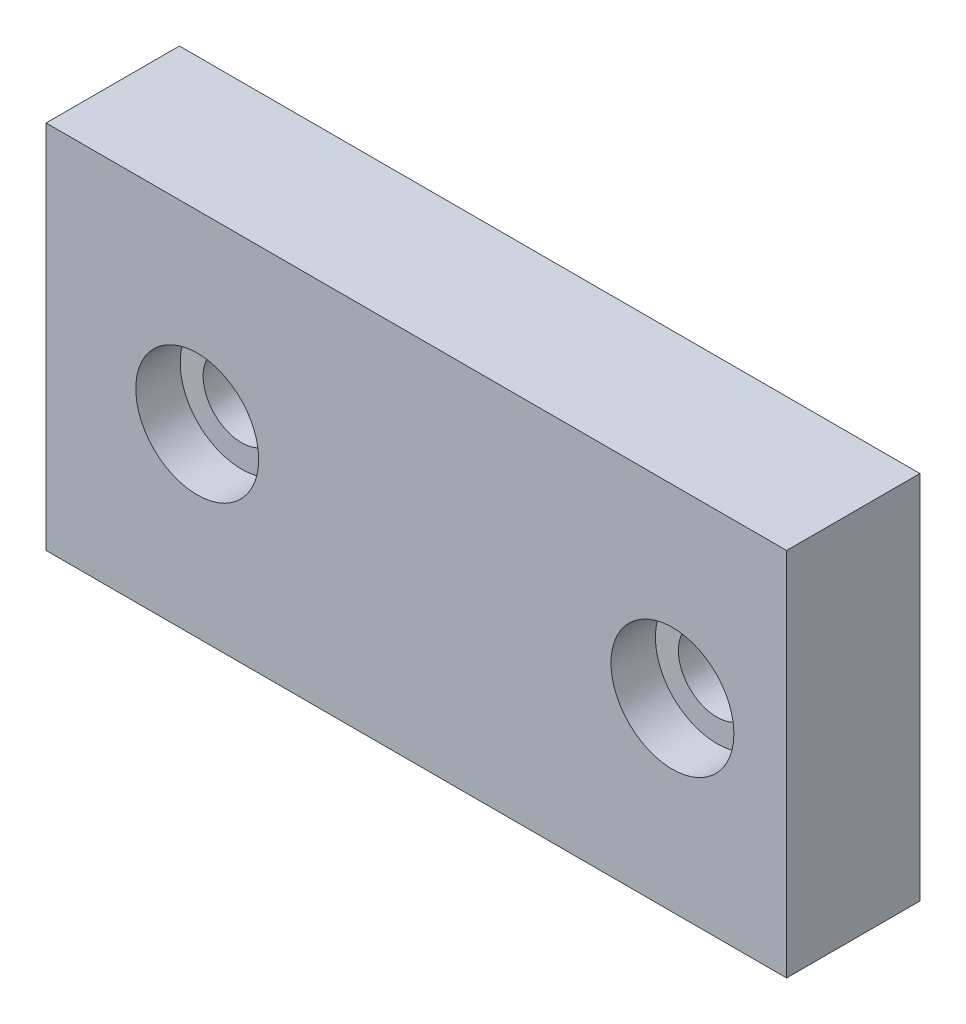
ISO-10303-21;
HEADER;
FILE_DESCRIPTION(('STEP AP214'),'2;1');
FILE_NAME('part.step','',(''),(''),'','','');
FILE_SCHEMA(('AUTOMOTIVE_DESIGN { 1 0 10303 214 1 1 1 1 }'));
ENDSEC;
DATA;
#1=APPLICATION_CONTEXT('core data for automotive mechanical design processes');
#2=APPLICATION_PROTOCOL_DEFINITION('international standard','automotive_design',2000,#1);
#3=PRODUCT_CONTEXT('',#1,'mechanical');
#4=PRODUCT('Part','Part','',(#3));
#5=PRODUCT_RELATED_PRODUCT_CATEGORY('part','',(#4));
#6=PRODUCT_DEFINITION_FORMATION('','',#4);
#7=PRODUCT_DEFINITION_CONTEXT('part definition',#1,'design');
#8=PRODUCT_DEFINITION('design','',#6,#7);
#9=PRODUCT_DEFINITION_SHAPE('','',#8);
#10=(LENGTH_UNIT() NAMED_UNIT(*) SI_UNIT(.MILLI.,.METRE.));
#11=(NAMED_UNIT(*) PLANE_ANGLE_UNIT() SI_UNIT($,.RADIAN.));
#12=(NAMED_UNIT(*) SI_UNIT($,.STERADIAN.) SOLID_ANGLE_UNIT());
#13=UNCERTAINTY_MEASURE_WITH_UNIT(LENGTH_MEASURE(1.E-05),#10,'distance_accuracy_value','');
#14=(GEOMETRIC_REPRESENTATION_CONTEXT(3) GLOBAL_UNCERTAINTY_ASSIGNED_CONTEXT((#13)) GLOBAL_UNIT_ASSIGNED_CONTEXT((#10,
#11,#12)) REPRESENTATION_CONTEXT('',''));
#15=CARTESIAN_POINT('',(0.,0.,0.));
#16=DIRECTION('',(0.,0.,1.));
#17=DIRECTION('',(1.,0.,0.));
#18=AXIS2_PLACEMENT_3D('',#15,#16,#17);
#19=CARTESIAN_POINT('',(96.2916372040886,12.5,-75.));
#20=DIRECTION('',(0.,0.,1.));
#21=DIRECTION('',(1.,0.,0.));
#22=AXIS2_PLACEMENT_3D('',#19,#20,#21);
#23=CYLINDRICAL_SURFACE('',#22,2.6);
#24=CARTESIAN_POINT('',(96.2916372040886,12.5,17.5));
#25=DIRECTION('',(0.,0.,1.));
#26=DIRECTION('',(1.,0.,0.));
#27=AXIS2_PLACEMENT_3D('',#24,#25,#26);
#28=CIRCLE('',#27,2.6);
#29=CARTESIAN_POINT('',(98.8916372040886,12.5,17.5));
#30=VERTEX_POINT('',#29);
#31=EDGE_CURVE('E108',#30,#30,#28,.T.);
#32=ORIENTED_EDGE('',*,*,#31,.F.);
#33=EDGE_LOOP('',(#32));
#34=FACE_BOUND('',#33,.T.);
#35=CARTESIAN_POINT('',(96.2916372040886,12.5,23.5));
#36=DIRECTION('',(0.,0.,1.));
#37=DIRECTION('',(1.,0.,0.));
#38=AXIS2_PLACEMENT_3D('',#35,#36,#37);
#39=CIRCLE('',#38,2.6);
#40=CARTESIAN_POINT('',(98.8916372040886,12.5,23.5));
#41=VERTEX_POINT('',#40);
#42=EDGE_CURVE('E36',#41,#41,#39,.F.);
#43=ORIENTED_EDGE('',*,*,#42,.F.);
#44=EDGE_LOOP('',(#43));
#45=FACE_BOUND('',#44,.T.);
#46=ADVANCED_FACE('F32',(#34,#45),#23,.F.);
#47=CARTESIAN_POINT('',(64.2026492118892,12.5,-75.));
#48=DIRECTION('',(0.,0.,1.));
#49=DIRECTION('',(1.,0.,0.));
#50=AXIS2_PLACEMENT_3D('',#47,#48,#49);
#51=CYLINDRICAL_SURFACE('',#50,2.6);
#52=CARTESIAN_POINT('',(64.2026492118892,12.5,17.5));
#53=DIRECTION('',(0.,0.,1.));
#54=DIRECTION('',(1.,0.,0.));
#55=AXIS2_PLACEMENT_3D('',#52,#53,#54);
#56=CIRCLE('',#55,2.6);
#57=CARTESIAN_POINT('',(66.8026492118892,12.5,17.5));
#58=VERTEX_POINT('',#57);
#59=EDGE_CURVE('E102',#58,#58,#56,.T.);
#60=ORIENTED_EDGE('',*,*,#59,.F.);
#61=EDGE_LOOP('',(#60));
#62=FACE_BOUND('',#61,.T.);
#63=CARTESIAN_POINT('',(64.2026492118892,12.5,23.5));
#64=DIRECTION('',(0.,0.,1.));
#65=DIRECTION('',(1.,0.,0.));
#66=AXIS2_PLACEMENT_3D('',#63,#64,#65);
#67=CIRCLE('',#66,2.6);
#68=CARTESIAN_POINT('',(66.8026492118892,12.5,23.5));
#69=VERTEX_POINT('',#68);
#70=EDGE_CURVE('E112',#69,#69,#67,.F.);
#71=ORIENTED_EDGE('',*,*,#70,.F.);
#72=EDGE_LOOP('',(#71));
#73=FACE_BOUND('',#72,.T.);
#74=ADVANCED_FACE('F151',(#62,#73),#51,.F.);
#75=CARTESIAN_POINT('',(104.,0.,26.5));
#76=DIRECTION('',(-1.,0.,0.));
#77=DIRECTION('',(0.,0.,1.));
#78=AXIS2_PLACEMENT_3D('',#75,#76,#77);
#79=PLANE('',#78);
#80=DIRECTION('',(0.,1.,0.));
#81=VECTOR('',#80,1.);
#82=CARTESIAN_POINT('',(104.,0.,17.5));
#83=LINE('',#82,#81);
#84=CARTESIAN_POINT('',(104.,0.,17.5));
#85=VERTEX_POINT('',#84);
#86=CARTESIAN_POINT('',(104.,25.,17.5));
#87=VERTEX_POINT('',#86);
#88=EDGE_CURVE('E99',#85,#87,#83,.T.);
#89=ORIENTED_EDGE('',*,*,#88,.T.);
#90=DIRECTION('',(0.,0.,-1.));
#91=VECTOR('',#90,1.);
#92=CARTESIAN_POINT('',(104.,25.,26.5));
#93=LINE('',#92,#91);
#94=CARTESIAN_POINT('',(104.,25.,26.5));
#95=VERTEX_POINT('',#94);
#96=EDGE_CURVE('E11',#95,#87,#93,.T.);
#97=ORIENTED_EDGE('',*,*,#96,.F.);
#98=DIRECTION('',(0.,1.,0.));
#99=VECTOR('',#98,1.);
#100=CARTESIAN_POINT('',(104.,0.,26.5));
#101=LINE('',#100,#99);
#102=CARTESIAN_POINT('',(104.,0.,26.5));
#103=VERTEX_POINT('',#102);
#104=EDGE_CURVE('E86',#103,#95,#101,.T.);
#105=ORIENTED_EDGE('',*,*,#104,.F.);
#106=DIRECTION('',(0.,0.,-1.));
#107=VECTOR('',#106,1.);
#108=CARTESIAN_POINT('',(104.,0.,26.5));
#109=LINE('',#108,#107);
#110=EDGE_CURVE('E95',#103,#85,#109,.T.);
#111=ORIENTED_EDGE('',*,*,#110,.T.);
#112=EDGE_LOOP('',(#89,#97,#105,#111));
#113=FACE_BOUND('',#112,.T.);
#114=ADVANCED_FACE('F34',(#113),#79,.F.);
#115=CARTESIAN_POINT('',(104.,25.,26.5));
#116=DIRECTION('',(0.,-1.,0.));
#117=DIRECTION('',(0.,0.,-1.));
#118=AXIS2_PLACEMENT_3D('',#115,#116,#117);
#119=PLANE('',#118);
#120=DIRECTION('',(-1.,0.,0.));
#121=VECTOR('',#120,1.);
#122=CARTESIAN_POINT('',(104.,25.,17.5));
#123=LINE('',#122,#121);
#124=CARTESIAN_POINT('',(54.0000000000001,25.,17.5));
#125=VERTEX_POINT('',#124);
#126=EDGE_CURVE('E90',#87,#125,#123,.T.);
#127=ORIENTED_EDGE('',*,*,#126,.T.);
#128=DIRECTION('',(0.,0.,-1.));
#129=VECTOR('',#128,1.);
#130=CARTESIAN_POINT('',(54.0000000000001,25.,26.5));
#131=LINE('',#130,#129);
#132=CARTESIAN_POINT('',(54.0000000000001,25.,26.5));
#133=VERTEX_POINT('',#132);
#134=EDGE_CURVE('E42',#133,#125,#131,.T.);
#135=ORIENTED_EDGE('',*,*,#134,.F.);
#136=DIRECTION('',(-1.,0.,0.));
#137=VECTOR('',#136,1.);
#138=CARTESIAN_POINT('',(104.,25.,26.5));
#139=LINE('',#138,#137);
#140=EDGE_CURVE('E81',#95,#133,#139,.T.);
#141=ORIENTED_EDGE('',*,*,#140,.F.);
#142=ORIENTED_EDGE('',*,*,#96,.T.);
#143=EDGE_LOOP('',(#127,#135,#141,#142));
#144=FACE_BOUND('',#143,.T.);
#145=ADVANCED_FACE('F89',(#144),#119,.F.);
#146=CARTESIAN_POINT('',(54.0000000000001,25.,26.5));
#147=DIRECTION('',(1.,0.,0.));
#148=DIRECTION('',(0.,0.,-1.));
#149=AXIS2_PLACEMENT_3D('',#146,#147,#148);
#150=PLANE('',#149);
#151=DIRECTION('',(0.,-1.,0.));
#152=VECTOR('',#151,1.);
#153=CARTESIAN_POINT('',(54.0000000000001,25.,17.5));
#154=LINE('',#153,#152);
#155=CARTESIAN_POINT('',(54.0000000000001,0.,17.5));
#156=VERTEX_POINT('',#155);
#157=EDGE_CURVE('E68',#125,#156,#154,.T.);
#158=ORIENTED_EDGE('',*,*,#157,.T.);
#159=DIRECTION('',(0.,0.,-1.));
#160=VECTOR('',#159,1.);
#161=CARTESIAN_POINT('',(54.0000000000001,0.,26.5));
#162=LINE('',#161,#160);
#163=CARTESIAN_POINT('',(54.0000000000001,0.,26.5));
#164=VERTEX_POINT('',#163);
#165=EDGE_CURVE('E91',#164,#156,#162,.T.);
#166=ORIENTED_EDGE('',*,*,#165,.F.);
#167=DIRECTION('',(0.,-1.,0.));
#168=VECTOR('',#167,1.);
#169=CARTESIAN_POINT('',(54.0000000000001,25.,26.5));
#170=LINE('',#169,#168);
#171=EDGE_CURVE('E84',#133,#164,#170,.T.);
#172=ORIENTED_EDGE('',*,*,#171,.F.);
#173=ORIENTED_EDGE('',*,*,#134,.T.);
#174=EDGE_LOOP('',(#158,#166,#172,#173));
#175=FACE_BOUND('',#174,.T.);
#176=ADVANCED_FACE('F93',(#175),#150,.F.);
#177=CARTESIAN_POINT('',(54.0000000000001,0.,26.5));
#178=DIRECTION('',(0.,1.,0.));
#179=DIRECTION('',(-1.,0.,0.));
#180=AXIS2_PLACEMENT_3D('',#177,#178,#179);
#181=PLANE('',#180);
#182=DIRECTION('',(1.,0.,0.));
#183=VECTOR('',#182,1.);
#184=CARTESIAN_POINT('',(54.0000000000001,0.,17.5));
#185=LINE('',#184,#183);
#186=EDGE_CURVE('E74',#156,#85,#185,.T.);
#187=ORIENTED_EDGE('',*,*,#186,.T.);
#188=ORIENTED_EDGE('',*,*,#110,.F.);
#189=DIRECTION('',(1.,0.,0.));
#190=VECTOR('',#189,1.);
#191=CARTESIAN_POINT('',(54.0000000000001,0.,26.5));
#192=LINE('',#191,#190);
#193=EDGE_CURVE('E51',#164,#103,#192,.T.);
#194=ORIENTED_EDGE('',*,*,#193,.F.);
#195=ORIENTED_EDGE('',*,*,#165,.T.);
#196=EDGE_LOOP('',(#187,#188,#194,#195));
#197=FACE_BOUND('',#196,.T.);
#198=ADVANCED_FACE('F137',(#197),#181,.F.);
#199=CARTESIAN_POINT('',(0.,0.,26.5));
#200=DIRECTION('',(0.,0.,1.));
#201=DIRECTION('',(1.,0.,0.));
#202=AXIS2_PLACEMENT_3D('',#199,#200,#201);
#203=PLANE('',#202);
#204=CARTESIAN_POINT('',(96.2916372040886,12.5,26.5));
#205=DIRECTION('',(0.,0.,1.));
#206=DIRECTION('',(1.,0.,0.));
#207=AXIS2_PLACEMENT_3D('',#204,#205,#206);
#208=CIRCLE('',#207,4.15);
#209=CARTESIAN_POINT('',(100.441637204089,12.5,26.5));
#210=VERTEX_POINT('',#209);
#211=EDGE_CURVE('E119',#210,#210,#208,.T.);
#212=ORIENTED_EDGE('',*,*,#211,.F.);
#213=EDGE_LOOP('',(#212));
#214=FACE_BOUND('',#213,.T.);
#215=CARTESIAN_POINT('',(64.2026492118892,12.5,26.5));
#216=DIRECTION('',(0.,0.,1.));
#217=DIRECTION('',(1.,0.,0.));
#218=AXIS2_PLACEMENT_3D('',#215,#216,#217);
#219=CIRCLE('',#218,4.15);
#220=CARTESIAN_POINT('',(68.3526492118892,12.5,26.5));
#221=VERTEX_POINT('',#220);
#222=EDGE_CURVE('E129',#221,#221,#219,.T.);
#223=ORIENTED_EDGE('',*,*,#222,.F.);
#224=EDGE_LOOP('',(#223));
#225=FACE_BOUND('',#224,.T.);
#226=ORIENTED_EDGE('',*,*,#104,.T.);
#227=ORIENTED_EDGE('',*,*,#140,.T.);
#228=ORIENTED_EDGE('',*,*,#171,.T.);
#229=ORIENTED_EDGE('',*,*,#193,.T.);
#230=EDGE_LOOP('',(#226,#227,#228,#229));
#231=FACE_BOUND('',#230,.T.);
#232=ADVANCED_FACE('F82',(#214,#225,#231),#203,.T.);
#233=CARTESIAN_POINT('',(0.,0.,17.5));
#234=DIRECTION('',(0.,0.,1.));
#235=DIRECTION('',(1.,0.,0.));
#236=AXIS2_PLACEMENT_3D('',#233,#234,#235);
#237=PLANE('',#236);
#238=ORIENTED_EDGE('',*,*,#59,.T.);
#239=EDGE_LOOP('',(#238));
#240=FACE_BOUND('',#239,.T.);
#241=ORIENTED_EDGE('',*,*,#31,.T.);
#242=EDGE_LOOP('',(#241));
#243=FACE_BOUND('',#242,.T.);
#244=ORIENTED_EDGE('',*,*,#88,.F.);
#245=ORIENTED_EDGE('',*,*,#186,.F.);
#246=ORIENTED_EDGE('',*,*,#157,.F.);
#247=ORIENTED_EDGE('',*,*,#126,.F.);
#248=EDGE_LOOP('',(#244,#245,#246,#247));
#249=FACE_BOUND('',#248,.T.);
#250=ADVANCED_FACE('F136',(#240,#243,#249),#237,.F.);
#251=CARTESIAN_POINT('',(64.2026492118892,12.5,23.5));
#252=DIRECTION('',(0.,0.,1.));
#253=DIRECTION('',(1.,0.,0.));
#254=AXIS2_PLACEMENT_3D('',#251,#252,#253);
#255=PLANE('',#254);
#256=CARTESIAN_POINT('',(64.2026492118892,12.5,23.5));
#257=DIRECTION('',(0.,0.,1.));
#258=DIRECTION('',(1.,0.,0.));
#259=AXIS2_PLACEMENT_3D('',#256,#257,#258);
#260=CIRCLE('',#259,4.15);
#261=CARTESIAN_POINT('',(68.3526492118892,12.5,23.5));
#262=VERTEX_POINT('',#261);
#263=EDGE_CURVE('E124',#262,#262,#260,.T.);
#264=ORIENTED_EDGE('',*,*,#263,.T.);
#265=EDGE_LOOP('',(#264));
#266=FACE_BOUND('',#265,.T.);
#267=ORIENTED_EDGE('',*,*,#70,.T.);
#268=EDGE_LOOP('',(#267));
#269=FACE_BOUND('',#268,.T.);
#270=ADVANCED_FACE('F144',(#266,#269),#255,.T.);
#271=CARTESIAN_POINT('',(64.2026492118892,12.5,23.5));
#272=DIRECTION('',(0.,0.,1.));
#273=DIRECTION('',(1.,0.,0.));
#274=AXIS2_PLACEMENT_3D('',#271,#272,#273);
#275=CYLINDRICAL_SURFACE('',#274,4.15);
#276=ORIENTED_EDGE('',*,*,#263,.F.);
#277=EDGE_LOOP('',(#276));
#278=FACE_BOUND('',#277,.T.);
#279=ORIENTED_EDGE('',*,*,#222,.T.);
#280=EDGE_LOOP('',(#279));
#281=FACE_BOUND('',#280,.T.);
#282=ADVANCED_FACE('F133',(#278,#281),#275,.F.);
#283=CARTESIAN_POINT('',(96.2916372040886,12.5,23.5));
#284=DIRECTION('',(0.,0.,1.));
#285=DIRECTION('',(1.,0.,0.));
#286=AXIS2_PLACEMENT_3D('',#283,#284,#285);
#287=PLANE('',#286);
#288=CARTESIAN_POINT('',(96.2916372040886,12.5,23.5));
#289=DIRECTION('',(0.,0.,1.));
#290=DIRECTION('',(1.,0.,0.));
#291=AXIS2_PLACEMENT_3D('',#288,#289,#290);
#292=CIRCLE('',#291,4.15);
#293=CARTESIAN_POINT('',(100.441637204089,12.5,23.5));
#294=VERTEX_POINT('',#293);
#295=EDGE_CURVE('E114',#294,#294,#292,.T.);
#296=ORIENTED_EDGE('',*,*,#295,.T.);
#297=EDGE_LOOP('',(#296));
#298=FACE_BOUND('',#297,.T.);
#299=ORIENTED_EDGE('',*,*,#42,.T.);
#300=EDGE_LOOP('',(#299));
#301=FACE_BOUND('',#300,.T.);
#302=ADVANCED_FACE('F163',(#298,#301),#287,.T.);
#303=CARTESIAN_POINT('',(96.2916372040886,12.5,23.5));
#304=DIRECTION('',(0.,0.,1.));
#305=DIRECTION('',(1.,0.,0.));
#306=AXIS2_PLACEMENT_3D('',#303,#304,#305);
#307=CYLINDRICAL_SURFACE('',#306,4.15);
#308=ORIENTED_EDGE('',*,*,#295,.F.);
#309=EDGE_LOOP('',(#308));
#310=FACE_BOUND('',#309,.T.);
#311=ORIENTED_EDGE('',*,*,#211,.T.);
#312=EDGE_LOOP('',(#311));
#313=FACE_BOUND('',#312,.T.);
#314=ADVANCED_FACE('F168',(#310,#313),#307,.F.);
#315=CLOSED_SHELL('',(#46,#74,#114,#145,#176,#198,#232,#250,#270,#282,#302,#314));
#316=MANIFOLD_SOLID_BREP('B2',#315);
#317=ADVANCED_BREP_SHAPE_REPRESENTATION('',(#18,#316),#14);
#318=SHAPE_DEFINITION_REPRESENTATION(#9,#317);
ENDSEC;
END-ISO-10303-21;
